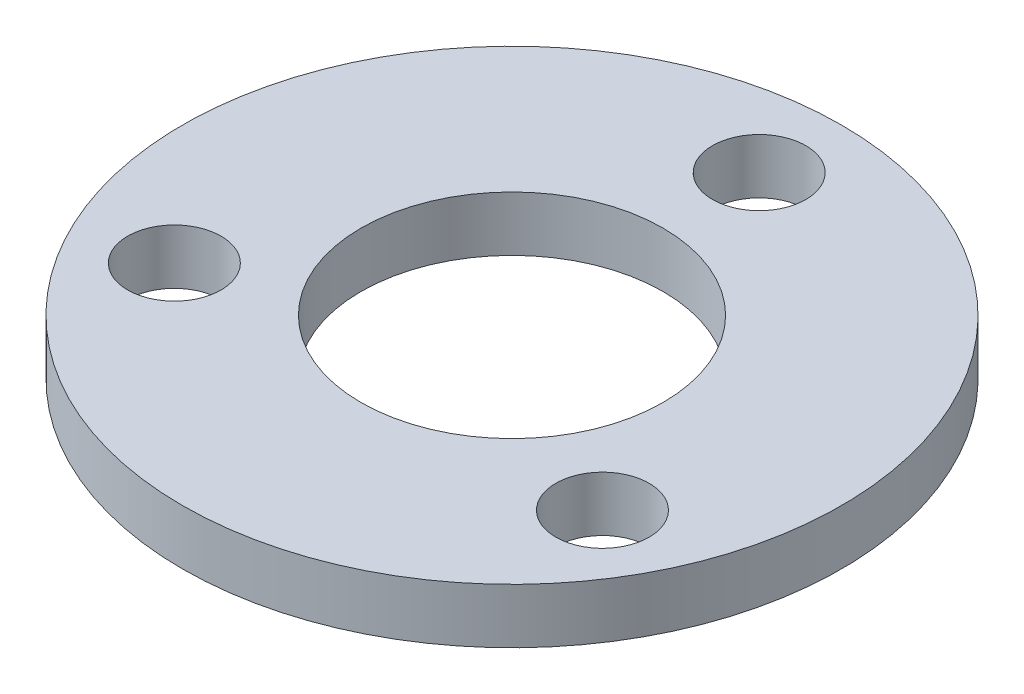
ISO-10303-21;
HEADER;
FILE_DESCRIPTION(('STEP AP214'),'2;1');
FILE_NAME('part.step','',(''),(''),'','','');
FILE_SCHEMA(('AUTOMOTIVE_DESIGN { 1 0 10303 214 1 1 1 1 }'));
ENDSEC;
DATA;
#1=APPLICATION_CONTEXT('core data for automotive mechanical design processes');
#2=APPLICATION_PROTOCOL_DEFINITION('international standard','automotive_design',2000,#1);
#3=PRODUCT_CONTEXT('',#1,'mechanical');
#4=PRODUCT('Part','Part','',(#3));
#5=PRODUCT_RELATED_PRODUCT_CATEGORY('part','',(#4));
#6=PRODUCT_DEFINITION_FORMATION('','',#4);
#7=PRODUCT_DEFINITION_CONTEXT('part definition',#1,'design');
#8=PRODUCT_DEFINITION('design','',#6,#7);
#9=PRODUCT_DEFINITION_SHAPE('','',#8);
#10=(LENGTH_UNIT() NAMED_UNIT(*) SI_UNIT(.MILLI.,.METRE.));
#11=(NAMED_UNIT(*) PLANE_ANGLE_UNIT() SI_UNIT($,.RADIAN.));
#12=(NAMED_UNIT(*) SI_UNIT($,.STERADIAN.) SOLID_ANGLE_UNIT());
#13=UNCERTAINTY_MEASURE_WITH_UNIT(LENGTH_MEASURE(1.E-05),#10,'distance_accuracy_value','');
#14=(GEOMETRIC_REPRESENTATION_CONTEXT(3) GLOBAL_UNCERTAINTY_ASSIGNED_CONTEXT((#13)) GLOBAL_UNIT_ASSIGNED_CONTEXT((#10,
#11,#12)) REPRESENTATION_CONTEXT('',''));
#15=CARTESIAN_POINT('',(0.,0.,0.));
#16=DIRECTION('',(0.,0.,1.));
#17=DIRECTION('',(1.,0.,0.));
#18=AXIS2_PLACEMENT_3D('',#15,#16,#17);
#19=CARTESIAN_POINT('',(0.,2.,0.));
#20=DIRECTION('',(0.,1.,0.));
#21=DIRECTION('',(0.,0.,1.));
#22=AXIS2_PLACEMENT_3D('',#19,#20,#21);
#23=PLANE('',#22);
#24=CARTESIAN_POINT('',(0.,2.,0.));
#25=DIRECTION('',(0.,1.,0.));
#26=DIRECTION('',(0.,0.,1.));
#27=AXIS2_PLACEMENT_3D('',#24,#25,#26);
#28=CIRCLE('',#27,5.5);
#29=CARTESIAN_POINT('',(0.,2.,5.5));
#30=VERTEX_POINT('',#29);
#31=EDGE_CURVE('E55',#30,#30,#28,.T.);
#32=ORIENTED_EDGE('',*,*,#31,.F.);
#33=EDGE_LOOP('',(#32));
#34=FACE_BOUND('',#33,.T.);
#35=CARTESIAN_POINT('',(0.,2.,-9.));
#36=DIRECTION('',(0.,1.,0.));
#37=DIRECTION('',(0.,0.,1.));
#38=AXIS2_PLACEMENT_3D('',#35,#36,#37);
#39=CIRCLE('',#38,1.7);
#40=CARTESIAN_POINT('',(0.,2.,-7.3));
#41=VERTEX_POINT('',#40);
#42=EDGE_CURVE('E44',#41,#41,#39,.T.);
#43=ORIENTED_EDGE('',*,*,#42,.F.);
#44=EDGE_LOOP('',(#43));
#45=FACE_BOUND('',#44,.T.);
#46=CARTESIAN_POINT('',(0.,2.,0.));
#47=DIRECTION('',(0.,1.,0.));
#48=DIRECTION('',(0.,0.,1.));
#49=AXIS2_PLACEMENT_3D('',#46,#47,#48);
#50=CIRCLE('',#49,12.);
#51=CARTESIAN_POINT('',(0.,2.,12.));
#52=VERTEX_POINT('',#51);
#53=EDGE_CURVE('E10',#52,#52,#50,.T.);
#54=ORIENTED_EDGE('',*,*,#53,.T.);
#55=EDGE_LOOP('',(#54));
#56=FACE_BOUND('',#55,.T.);
#57=CARTESIAN_POINT('',(-7.79422863405999,2.,4.49999999999993));
#58=DIRECTION('',(0.,1.,0.));
#59=DIRECTION('',(0.,0.,1.));
#60=AXIS2_PLACEMENT_3D('',#57,#58,#59);
#61=CIRCLE('',#60,1.7);
#62=CARTESIAN_POINT('',(-7.79422863405999,2.,6.19999999999993));
#63=VERTEX_POINT('',#62);
#64=EDGE_CURVE('E49',#63,#63,#61,.T.);
#65=ORIENTED_EDGE('',*,*,#64,.F.);
#66=EDGE_LOOP('',(#65));
#67=FACE_BOUND('',#66,.T.);
#68=CARTESIAN_POINT('',(7.79422863405993,2.,4.50000000000004));
#69=DIRECTION('',(0.,1.,0.));
#70=DIRECTION('',(0.,0.,1.));
#71=AXIS2_PLACEMENT_3D('',#68,#69,#70);
#72=CIRCLE('',#71,1.7);
#73=CARTESIAN_POINT('',(7.79422863405993,2.,6.20000000000004));
#74=VERTEX_POINT('',#73);
#75=EDGE_CURVE('E61',#74,#74,#72,.T.);
#76=ORIENTED_EDGE('',*,*,#75,.F.);
#77=EDGE_LOOP('',(#76));
#78=FACE_BOUND('',#77,.T.);
#79=ADVANCED_FACE('F33',(#34,#45,#56,#67,#78),#23,.T.);
#80=CARTESIAN_POINT('',(0.,0.,0.));
#81=DIRECTION('',(0.,1.,0.));
#82=DIRECTION('',(0.,0.,1.));
#83=AXIS2_PLACEMENT_3D('',#80,#81,#82);
#84=PLANE('',#83);
#85=CARTESIAN_POINT('',(0.,0.,0.));
#86=DIRECTION('',(0.,1.,0.));
#87=DIRECTION('',(0.,0.,1.));
#88=AXIS2_PLACEMENT_3D('',#85,#86,#87);
#89=CIRCLE('',#88,12.);
#90=CARTESIAN_POINT('',(0.,0.,12.));
#91=VERTEX_POINT('',#90);
#92=EDGE_CURVE('E37',#91,#91,#89,.T.);
#93=ORIENTED_EDGE('',*,*,#92,.F.);
#94=EDGE_LOOP('',(#93));
#95=FACE_BOUND('',#94,.T.);
#96=CARTESIAN_POINT('',(0.,0.,-9.));
#97=DIRECTION('',(0.,1.,0.));
#98=DIRECTION('',(0.,0.,1.));
#99=AXIS2_PLACEMENT_3D('',#96,#97,#98);
#100=CIRCLE('',#99,1.7);
#101=CARTESIAN_POINT('',(0.,0.,-7.3));
#102=VERTEX_POINT('',#101);
#103=EDGE_CURVE('E46',#102,#102,#100,.T.);
#104=ORIENTED_EDGE('',*,*,#103,.T.);
#105=EDGE_LOOP('',(#104));
#106=FACE_BOUND('',#105,.T.);
#107=CARTESIAN_POINT('',(-7.79422863405999,0.,4.49999999999993));
#108=DIRECTION('',(0.,1.,0.));
#109=DIRECTION('',(0.,0.,1.));
#110=AXIS2_PLACEMENT_3D('',#107,#108,#109);
#111=CIRCLE('',#110,1.7);
#112=CARTESIAN_POINT('',(-7.79422863405999,0.,6.19999999999993));
#113=VERTEX_POINT('',#112);
#114=EDGE_CURVE('E52',#113,#113,#111,.T.);
#115=ORIENTED_EDGE('',*,*,#114,.T.);
#116=EDGE_LOOP('',(#115));
#117=FACE_BOUND('',#116,.T.);
#118=CARTESIAN_POINT('',(0.,0.,0.));
#119=DIRECTION('',(0.,1.,0.));
#120=DIRECTION('',(0.,0.,1.));
#121=AXIS2_PLACEMENT_3D('',#118,#119,#120);
#122=CIRCLE('',#121,5.5);
#123=CARTESIAN_POINT('',(0.,0.,5.5));
#124=VERTEX_POINT('',#123);
#125=EDGE_CURVE('E58',#124,#124,#122,.T.);
#126=ORIENTED_EDGE('',*,*,#125,.T.);
#127=EDGE_LOOP('',(#126));
#128=FACE_BOUND('',#127,.T.);
#129=CARTESIAN_POINT('',(7.79422863405993,0.,4.50000000000004));
#130=DIRECTION('',(0.,1.,0.));
#131=DIRECTION('',(0.,0.,1.));
#132=AXIS2_PLACEMENT_3D('',#129,#130,#131);
#133=CIRCLE('',#132,1.7);
#134=CARTESIAN_POINT('',(7.79422863405993,0.,6.20000000000004));
#135=VERTEX_POINT('',#134);
#136=EDGE_CURVE('E64',#135,#135,#133,.T.);
#137=ORIENTED_EDGE('',*,*,#136,.T.);
#138=EDGE_LOOP('',(#137));
#139=FACE_BOUND('',#138,.T.);
#140=ADVANCED_FACE('F74',(#95,#106,#117,#128,#139),#84,.F.);
#141=CARTESIAN_POINT('',(0.,2.,0.));
#142=DIRECTION('',(0.,-1.,0.));
#143=DIRECTION('',(0.,0.,-1.));
#144=AXIS2_PLACEMENT_3D('',#141,#142,#143);
#145=CYLINDRICAL_SURFACE('',#144,12.);
#146=ORIENTED_EDGE('',*,*,#53,.F.);
#147=EDGE_LOOP('',(#146));
#148=FACE_BOUND('',#147,.T.);
#149=ORIENTED_EDGE('',*,*,#92,.T.);
#150=EDGE_LOOP('',(#149));
#151=FACE_BOUND('',#150,.T.);
#152=ADVANCED_FACE('F35',(#148,#151),#145,.T.);
#153=CARTESIAN_POINT('',(0.,2.,-9.));
#154=DIRECTION('',(0.,-1.,0.));
#155=DIRECTION('',(0.,0.,-1.));
#156=AXIS2_PLACEMENT_3D('',#153,#154,#155);
#157=CYLINDRICAL_SURFACE('',#156,1.7);
#158=ORIENTED_EDGE('',*,*,#42,.T.);
#159=EDGE_LOOP('',(#158));
#160=FACE_BOUND('',#159,.T.);
#161=ORIENTED_EDGE('',*,*,#103,.F.);
#162=EDGE_LOOP('',(#161));
#163=FACE_BOUND('',#162,.T.);
#164=ADVANCED_FACE('F84',(#160,#163),#157,.F.);
#165=CARTESIAN_POINT('',(-7.79422863405999,2.,4.49999999999993));
#166=DIRECTION('',(0.,-1.,0.));
#167=DIRECTION('',(0.,0.,-1.));
#168=AXIS2_PLACEMENT_3D('',#165,#166,#167);
#169=CYLINDRICAL_SURFACE('',#168,1.7);
#170=ORIENTED_EDGE('',*,*,#64,.T.);
#171=EDGE_LOOP('',(#170));
#172=FACE_BOUND('',#171,.T.);
#173=ORIENTED_EDGE('',*,*,#114,.F.);
#174=EDGE_LOOP('',(#173));
#175=FACE_BOUND('',#174,.T.);
#176=ADVANCED_FACE('F87',(#172,#175),#169,.F.);
#177=CARTESIAN_POINT('',(0.,2.,0.));
#178=DIRECTION('',(0.,-1.,0.));
#179=DIRECTION('',(0.,0.,-1.));
#180=AXIS2_PLACEMENT_3D('',#177,#178,#179);
#181=CYLINDRICAL_SURFACE('',#180,5.5);
#182=ORIENTED_EDGE('',*,*,#31,.T.);
#183=EDGE_LOOP('',(#182));
#184=FACE_BOUND('',#183,.T.);
#185=ORIENTED_EDGE('',*,*,#125,.F.);
#186=EDGE_LOOP('',(#185));
#187=FACE_BOUND('',#186,.T.);
#188=ADVANCED_FACE('F91',(#184,#187),#181,.F.);
#189=CARTESIAN_POINT('',(7.79422863405993,2.,4.50000000000004));
#190=DIRECTION('',(0.,-1.,0.));
#191=DIRECTION('',(0.,0.,-1.));
#192=AXIS2_PLACEMENT_3D('',#189,#190,#191);
#193=CYLINDRICAL_SURFACE('',#192,1.7);
#194=ORIENTED_EDGE('',*,*,#75,.T.);
#195=EDGE_LOOP('',(#194));
#196=FACE_BOUND('',#195,.T.);
#197=ORIENTED_EDGE('',*,*,#136,.F.);
#198=EDGE_LOOP('',(#197));
#199=FACE_BOUND('',#198,.T.);
#200=ADVANCED_FACE('F70',(#196,#199),#193,.F.);
#201=CLOSED_SHELL('',(#79,#140,#152,#164,#176,#188,#200));
#202=MANIFOLD_SOLID_BREP('B2',#201);
#203=ADVANCED_BREP_SHAPE_REPRESENTATION('',(#18,#202),#14);
#204=SHAPE_DEFINITION_REPRESENTATION(#9,#203);
ENDSEC;
END-ISO-10303-21;
